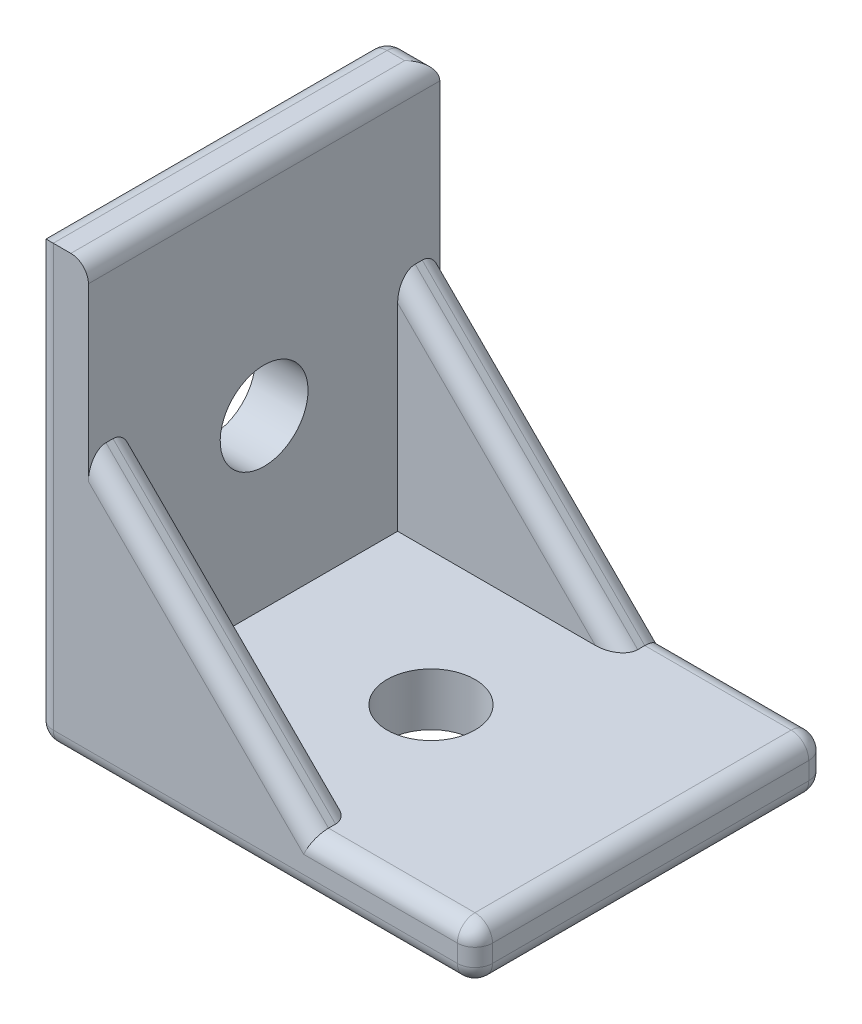
ISO-10303-21;
HEADER;
FILE_DESCRIPTION(('STEP AP214'),'2;1');
FILE_NAME('part.step','',(''),(''),'','','');
FILE_SCHEMA(('AUTOMOTIVE_DESIGN { 1 0 10303 214 1 1 1 1 }'));
ENDSEC;
DATA;
#1=APPLICATION_CONTEXT('core data for automotive mechanical design processes');
#2=APPLICATION_PROTOCOL_DEFINITION('international standard','automotive_design',2000,#1);
#3=PRODUCT_CONTEXT('',#1,'mechanical');
#4=PRODUCT('Part','Part','',(#3));
#5=PRODUCT_RELATED_PRODUCT_CATEGORY('part','',(#4));
#6=PRODUCT_DEFINITION_FORMATION('','',#4);
#7=PRODUCT_DEFINITION_CONTEXT('part definition',#1,'design');
#8=PRODUCT_DEFINITION('design','',#6,#7);
#9=PRODUCT_DEFINITION_SHAPE('','',#8);
#10=(LENGTH_UNIT() NAMED_UNIT(*) SI_UNIT(.MILLI.,.METRE.));
#11=(NAMED_UNIT(*) PLANE_ANGLE_UNIT() SI_UNIT($,.RADIAN.));
#12=(NAMED_UNIT(*) SI_UNIT($,.STERADIAN.) SOLID_ANGLE_UNIT());
#13=UNCERTAINTY_MEASURE_WITH_UNIT(LENGTH_MEASURE(1.E-05),#10,'distance_accuracy_value','');
#14=(GEOMETRIC_REPRESENTATION_CONTEXT(3) GLOBAL_UNCERTAINTY_ASSIGNED_CONTEXT((#13)) GLOBAL_UNIT_ASSIGNED_CONTEXT((#10,
#11,#12)) REPRESENTATION_CONTEXT('',''));
#15=CARTESIAN_POINT('',(0.,0.,0.));
#16=DIRECTION('',(0.,0.,1.));
#17=DIRECTION('',(1.,0.,0.));
#18=AXIS2_PLACEMENT_3D('',#15,#16,#17);
#19=CARTESIAN_POINT('',(12.5,12.5,20.));
#20=DIRECTION('',(-1.,0.,0.));
#21=DIRECTION('',(0.,-1.,0.));
#22=AXIS2_PLACEMENT_3D('',#19,#20,#21);
#23=PLANE('',#22);
#24=DIRECTION('',(0.,1.,0.));
#25=VECTOR('',#24,1.);
#26=CARTESIAN_POINT('',(12.5,-12.5,19.));
#27=LINE('',#26,#25);
#28=CARTESIAN_POINT('',(12.5,-10.5,19.));
#29=VERTEX_POINT('',#28);
#30=CARTESIAN_POINT('',(12.5,-11.5,19.));
#31=VERTEX_POINT('',#30);
#32=EDGE_CURVE('E243',#29,#31,#27,.F.);
#33=ORIENTED_EDGE('',*,*,#32,.T.);
#34=DIRECTION('',(0.,0.,-1.));
#35=VECTOR('',#34,1.);
#36=CARTESIAN_POINT('',(12.5,-11.5,20.));
#37=LINE('',#36,#35);
#38=CARTESIAN_POINT('',(12.5,-11.5,1.));
#39=VERTEX_POINT('',#38);
#40=EDGE_CURVE('E248',#31,#39,#37,.T.);
#41=ORIENTED_EDGE('',*,*,#40,.T.);
#42=DIRECTION('',(0.,1.,0.));
#43=VECTOR('',#42,1.);
#44=CARTESIAN_POINT('',(12.5,12.5,1.));
#45=LINE('',#44,#43);
#46=CARTESIAN_POINT('',(12.5,-10.5,1.));
#47=VERTEX_POINT('',#46);
#48=EDGE_CURVE('E245',#39,#47,#45,.T.);
#49=ORIENTED_EDGE('',*,*,#48,.T.);
#50=DIRECTION('',(0.,0.,1.));
#51=VECTOR('',#50,1.);
#52=CARTESIAN_POINT('',(12.5,-10.5,20.));
#53=LINE('',#52,#51);
#54=EDGE_CURVE('E241',#47,#29,#53,.T.);
#55=ORIENTED_EDGE('',*,*,#54,.T.);
#56=EDGE_LOOP('',(#33,#41,#49,#55));
#57=FACE_BOUND('',#56,.T.);
#58=ADVANCED_FACE('F37',(#57),#23,.F.);
#59=CARTESIAN_POINT('',(0.,0.,20.));
#60=DIRECTION('',(0.,0.,1.));
#61=DIRECTION('',(1.,0.,0.));
#62=AXIS2_PLACEMENT_3D('',#59,#60,#61);
#63=PLANE('',#62);
#64=DIRECTION('',(0.,-1.,0.));
#65=VECTOR('',#64,1.);
#66=CARTESIAN_POINT('',(-9.5,12.5,20.));
#67=LINE('',#66,#65);
#68=CARTESIAN_POINT('',(-9.5,11.5,20.));
#69=VERTEX_POINT('',#68);
#70=CARTESIAN_POINT('',(-9.5,1.75245310429357,20.));
#71=VERTEX_POINT('',#70);
#72=EDGE_CURVE('E380',#69,#71,#67,.T.);
#73=ORIENTED_EDGE('',*,*,#72,.F.);
#74=CARTESIAN_POINT('',(-10.5,11.5,20.));
#75=DIRECTION('',(0.,0.,1.));
#76=DIRECTION('',(1.,0.,0.));
#77=AXIS2_PLACEMENT_3D('',#74,#75,#76);
#78=CIRCLE('',#77,1.);
#79=CARTESIAN_POINT('',(-10.5,12.5,20.));
#80=VERTEX_POINT('',#79);
#81=EDGE_CURVE('E291',#69,#80,#78,.T.);
#82=ORIENTED_EDGE('',*,*,#81,.T.);
#83=DIRECTION('',(-1.,0.,0.));
#84=VECTOR('',#83,1.);
#85=CARTESIAN_POINT('',(-12.5,12.5,20.));
#86=LINE('',#85,#84);
#87=CARTESIAN_POINT('',(-11.5,12.5,20.));
#88=VERTEX_POINT('',#87);
#89=EDGE_CURVE('E210',#80,#88,#86,.T.);
#90=ORIENTED_EDGE('',*,*,#89,.T.);
#91=DIRECTION('',(0.,-1.,0.));
#92=VECTOR('',#91,1.);
#93=CARTESIAN_POINT('',(-11.5,-12.5,20.));
#94=LINE('',#93,#92);
#95=CARTESIAN_POINT('',(-11.5,-11.5,20.));
#96=VERTEX_POINT('',#95);
#97=EDGE_CURVE('E54',#88,#96,#94,.T.);
#98=ORIENTED_EDGE('',*,*,#97,.T.);
#99=DIRECTION('',(1.,0.,0.));
#100=VECTOR('',#99,1.);
#101=CARTESIAN_POINT('',(12.5,-11.5,20.));
#102=LINE('',#101,#100);
#103=CARTESIAN_POINT('',(11.5,-11.5,20.));
#104=VERTEX_POINT('',#103);
#105=EDGE_CURVE('E59',#96,#104,#102,.T.);
#106=ORIENTED_EDGE('',*,*,#105,.T.);
#107=DIRECTION('',(0.,1.,0.));
#108=VECTOR('',#107,1.);
#109=CARTESIAN_POINT('',(11.5,-9.5,20.));
#110=LINE('',#109,#108);
#111=CARTESIAN_POINT('',(11.5,-10.5,20.));
#112=VERTEX_POINT('',#111);
#113=EDGE_CURVE('E287',#104,#112,#110,.T.);
#114=ORIENTED_EDGE('',*,*,#113,.T.);
#115=DIRECTION('',(-1.,0.,0.));
#116=VECTOR('',#115,1.);
#117=CARTESIAN_POINT('',(3.16666666666667,-10.5,20.));
#118=LINE('',#117,#116);
#119=CARTESIAN_POINT('',(2.75245310429357,-10.5,20.));
#120=VERTEX_POINT('',#119);
#121=EDGE_CURVE('E285',#112,#120,#118,.T.);
#122=ORIENTED_EDGE('',*,*,#121,.T.);
#123=DIRECTION('',(0.707106781186548,-0.707106781186548,0.));
#124=VECTOR('',#123,1.);
#125=CARTESIAN_POINT('',(-10.2071067811865,2.45955988548011,20.));
#126=LINE('',#125,#124);
#127=EDGE_CURVE('E282',#120,#71,#126,.F.);
#128=ORIENTED_EDGE('',*,*,#127,.T.);
#129=EDGE_LOOP('',(#73,#82,#90,#98,#106,#114,#122,#128));
#130=FACE_BOUND('',#129,.T.);
#131=ADVANCED_FACE('F426',(#130),#63,.T.);
#132=CARTESIAN_POINT('',(0.,0.,0.));
#133=DIRECTION('',(0.,0.,1.));
#134=DIRECTION('',(1.,0.,0.));
#135=AXIS2_PLACEMENT_3D('',#132,#133,#134);
#136=PLANE('',#135);
#137=DIRECTION('',(0.,-1.,0.));
#138=VECTOR('',#137,1.);
#139=CARTESIAN_POINT('',(-9.5,12.5,0.));
#140=LINE('',#139,#138);
#141=CARTESIAN_POINT('',(-9.5,11.5,0.));
#142=VERTEX_POINT('',#141);
#143=CARTESIAN_POINT('',(-9.5,1.75245310429357,0.));
#144=VERTEX_POINT('',#143);
#145=EDGE_CURVE('E393',#142,#144,#140,.T.);
#146=ORIENTED_EDGE('',*,*,#145,.T.);
#147=DIRECTION('',(0.707106781186548,-0.707106781186548,0.));
#148=VECTOR('',#147,1.);
#149=CARTESIAN_POINT('',(-3.87377344785321,-3.87377344785321,0.));
#150=LINE('',#149,#148);
#151=CARTESIAN_POINT('',(2.75245310429357,-10.5,0.));
#152=VERTEX_POINT('',#151);
#153=EDGE_CURVE('E233',#144,#152,#150,.T.);
#154=ORIENTED_EDGE('',*,*,#153,.T.);
#155=DIRECTION('',(-1.,0.,0.));
#156=VECTOR('',#155,1.);
#157=CARTESIAN_POINT('',(0.,-10.5,0.));
#158=LINE('',#157,#156);
#159=CARTESIAN_POINT('',(11.5,-10.5,0.));
#160=VERTEX_POINT('',#159);
#161=EDGE_CURVE('E231',#152,#160,#158,.F.);
#162=ORIENTED_EDGE('',*,*,#161,.T.);
#163=DIRECTION('',(0.,1.,0.));
#164=VECTOR('',#163,1.);
#165=CARTESIAN_POINT('',(11.5,0.,0.));
#166=LINE('',#165,#164);
#167=CARTESIAN_POINT('',(11.5,-11.5,0.));
#168=VERTEX_POINT('',#167);
#169=EDGE_CURVE('E229',#160,#168,#166,.F.);
#170=ORIENTED_EDGE('',*,*,#169,.T.);
#171=DIRECTION('',(1.,0.,0.));
#172=VECTOR('',#171,1.);
#173=CARTESIAN_POINT('',(0.,-11.5,0.));
#174=LINE('',#173,#172);
#175=CARTESIAN_POINT('',(-11.5,-11.5,0.));
#176=VERTEX_POINT('',#175);
#177=EDGE_CURVE('E227',#168,#176,#174,.F.);
#178=ORIENTED_EDGE('',*,*,#177,.T.);
#179=DIRECTION('',(0.,-1.,0.));
#180=VECTOR('',#179,1.);
#181=CARTESIAN_POINT('',(-11.5,0.,0.));
#182=LINE('',#181,#180);
#183=CARTESIAN_POINT('',(-11.5,11.5,0.));
#184=VERTEX_POINT('',#183);
#185=EDGE_CURVE('E225',#176,#184,#182,.F.);
#186=ORIENTED_EDGE('',*,*,#185,.T.);
#187=DIRECTION('',(-1.,0.,0.));
#188=VECTOR('',#187,1.);
#189=CARTESIAN_POINT('',(0.,11.5,0.));
#190=LINE('',#189,#188);
#191=EDGE_CURVE('E223',#184,#142,#190,.F.);
#192=ORIENTED_EDGE('',*,*,#191,.T.);
#193=EDGE_LOOP('',(#146,#154,#162,#170,#178,#186,#192));
#194=FACE_BOUND('',#193,.T.);
#195=ADVANCED_FACE('F432',(#194),#136,.F.);
#196=CARTESIAN_POINT('',(-12.5,12.5,20.));
#197=DIRECTION('',(0.,-1.,0.));
#198=DIRECTION('',(0.,0.,-1.));
#199=AXIS2_PLACEMENT_3D('',#196,#197,#198);
#200=PLANE('',#199);
#201=ORIENTED_EDGE('',*,*,#89,.F.);
#202=DIRECTION('',(0.,0.,1.));
#203=VECTOR('',#202,1.);
#204=CARTESIAN_POINT('',(-10.5,12.5,20.));
#205=LINE('',#204,#203);
#206=CARTESIAN_POINT('',(-10.5,12.5,1.));
#207=VERTEX_POINT('',#206);
#208=EDGE_CURVE('E278',#80,#207,#205,.F.);
#209=ORIENTED_EDGE('',*,*,#208,.T.);
#210=DIRECTION('',(-1.,0.,0.));
#211=VECTOR('',#210,1.);
#212=CARTESIAN_POINT('',(-12.5,12.5,1.));
#213=LINE('',#212,#211);
#214=CARTESIAN_POINT('',(-11.5,12.5,1.));
#215=VERTEX_POINT('',#214);
#216=EDGE_CURVE('E276',#207,#215,#213,.T.);
#217=ORIENTED_EDGE('',*,*,#216,.T.);
#218=DIRECTION('',(0.,0.,-1.));
#219=VECTOR('',#218,1.);
#220=CARTESIAN_POINT('',(-11.5,12.5,20.));
#221=LINE('',#220,#219);
#222=EDGE_CURVE('E274',#215,#88,#221,.F.);
#223=ORIENTED_EDGE('',*,*,#222,.T.);
#224=EDGE_LOOP('',(#201,#209,#217,#223));
#225=FACE_BOUND('',#224,.T.);
#226=ADVANCED_FACE('F435',(#225),#200,.F.);
#227=CARTESIAN_POINT('',(-12.5,12.5,20.));
#228=DIRECTION('',(1.,0.,0.));
#229=DIRECTION('',(0.,1.,0.));
#230=AXIS2_PLACEMENT_3D('',#227,#228,#229);
#231=PLANE('',#230);
#232=CARTESIAN_POINT('',(-12.5,0.,10.));
#233=DIRECTION('',(-1.,0.,0.));
#234=DIRECTION('',(0.,-1.,0.));
#235=AXIS2_PLACEMENT_3D('',#232,#233,#234);
#236=CIRCLE('',#235,2.5);
#237=CARTESIAN_POINT('',(-12.5,-2.5,10.));
#238=VERTEX_POINT('',#237);
#239=EDGE_CURVE('E390',#238,#238,#236,.T.);
#240=ORIENTED_EDGE('',*,*,#239,.F.);
#241=EDGE_LOOP('',(#240));
#242=FACE_BOUND('',#241,.T.);
#243=DIRECTION('',(0.,-1.,0.));
#244=VECTOR('',#243,1.);
#245=CARTESIAN_POINT('',(-12.5,12.5,1.));
#246=LINE('',#245,#244);
#247=CARTESIAN_POINT('',(-12.5,11.5,1.));
#248=VERTEX_POINT('',#247);
#249=CARTESIAN_POINT('',(-12.5,-11.5,1.));
#250=VERTEX_POINT('',#249);
#251=EDGE_CURVE('E269',#248,#250,#246,.T.);
#252=ORIENTED_EDGE('',*,*,#251,.T.);
#253=DIRECTION('',(0.,0.,-1.));
#254=VECTOR('',#253,1.);
#255=CARTESIAN_POINT('',(-12.5,-11.5,20.));
#256=LINE('',#255,#254);
#257=CARTESIAN_POINT('',(-12.5,-11.5,19.));
#258=VERTEX_POINT('',#257);
#259=EDGE_CURVE('E271',#250,#258,#256,.F.);
#260=ORIENTED_EDGE('',*,*,#259,.T.);
#261=DIRECTION('',(0.,-1.,0.));
#262=VECTOR('',#261,1.);
#263=CARTESIAN_POINT('',(-12.5,12.5,19.));
#264=LINE('',#263,#262);
#265=CARTESIAN_POINT('',(-12.5,11.5,19.));
#266=VERTEX_POINT('',#265);
#267=EDGE_CURVE('E265',#258,#266,#264,.F.);
#268=ORIENTED_EDGE('',*,*,#267,.T.);
#269=DIRECTION('',(0.,0.,-1.));
#270=VECTOR('',#269,1.);
#271=CARTESIAN_POINT('',(-12.5,11.5,20.));
#272=LINE('',#271,#270);
#273=EDGE_CURVE('E267',#266,#248,#272,.T.);
#274=ORIENTED_EDGE('',*,*,#273,.T.);
#275=EDGE_LOOP('',(#252,#260,#268,#274));
#276=FACE_BOUND('',#275,.T.);
#277=ADVANCED_FACE('F548',(#242,#276),#231,.F.);
#278=CARTESIAN_POINT('',(-12.5,-12.5,20.));
#279=DIRECTION('',(0.,1.,0.));
#280=DIRECTION('',(0.,0.,1.));
#281=AXIS2_PLACEMENT_3D('',#278,#279,#280);
#282=PLANE('',#281);
#283=CARTESIAN_POINT('',(0.,-12.5,10.));
#284=DIRECTION('',(0.,-1.,0.));
#285=DIRECTION('',(0.,0.,-1.));
#286=AXIS2_PLACEMENT_3D('',#283,#284,#285);
#287=CIRCLE('',#286,2.5);
#288=CARTESIAN_POINT('',(0.,-12.5,7.5));
#289=VERTEX_POINT('',#288);
#290=EDGE_CURVE('E382',#289,#289,#287,.T.);
#291=ORIENTED_EDGE('',*,*,#290,.F.);
#292=EDGE_LOOP('',(#291));
#293=FACE_BOUND('',#292,.T.);
#294=DIRECTION('',(0.,0.,-1.));
#295=VECTOR('',#294,1.);
#296=CARTESIAN_POINT('',(-11.5,-12.5,20.));
#297=LINE('',#296,#295);
#298=CARTESIAN_POINT('',(-11.5,-12.5,19.));
#299=VERTEX_POINT('',#298);
#300=CARTESIAN_POINT('',(-11.5,-12.5,1.));
#301=VERTEX_POINT('',#300);
#302=EDGE_CURVE('E260',#299,#301,#297,.T.);
#303=ORIENTED_EDGE('',*,*,#302,.T.);
#304=DIRECTION('',(1.,0.,0.));
#305=VECTOR('',#304,1.);
#306=CARTESIAN_POINT('',(-12.5,-12.5,1.));
#307=LINE('',#306,#305);
#308=CARTESIAN_POINT('',(11.5,-12.5,1.));
#309=VERTEX_POINT('',#308);
#310=EDGE_CURVE('E262',#301,#309,#307,.T.);
#311=ORIENTED_EDGE('',*,*,#310,.T.);
#312=DIRECTION('',(0.,0.,-1.));
#313=VECTOR('',#312,1.);
#314=CARTESIAN_POINT('',(11.5,-12.5,20.));
#315=LINE('',#314,#313);
#316=CARTESIAN_POINT('',(11.5,-12.5,19.));
#317=VERTEX_POINT('',#316);
#318=EDGE_CURVE('E256',#309,#317,#315,.F.);
#319=ORIENTED_EDGE('',*,*,#318,.T.);
#320=DIRECTION('',(1.,0.,0.));
#321=VECTOR('',#320,1.);
#322=CARTESIAN_POINT('',(-12.5,-12.5,19.));
#323=LINE('',#322,#321);
#324=EDGE_CURVE('E258',#317,#299,#323,.F.);
#325=ORIENTED_EDGE('',*,*,#324,.T.);
#326=EDGE_LOOP('',(#303,#311,#319,#325));
#327=FACE_BOUND('',#326,.T.);
#328=ADVANCED_FACE('F586',(#293,#327),#282,.F.);
#329=CARTESIAN_POINT('',(12.5,-9.5,2.4));
#330=DIRECTION('',(0.,-1.,0.));
#331=DIRECTION('',(1.,0.,0.));
#332=AXIS2_PLACEMENT_3D('',#329,#330,#331);
#333=PLANE('',#332);
#334=CARTESIAN_POINT('',(0.,-9.5,10.));
#335=DIRECTION('',(0.,-1.,0.));
#336=DIRECTION('',(1.,0.,0.));
#337=AXIS2_PLACEMENT_3D('',#334,#335,#336);
#338=CIRCLE('',#337,2.5);
#339=CARTESIAN_POINT('',(2.50000000000001,-9.5,10.));
#340=VERTEX_POINT('',#339);
#341=EDGE_CURVE('E312',#340,#340,#338,.T.);
#342=ORIENTED_EDGE('',*,*,#341,.T.);
#343=EDGE_LOOP('',(#342));
#344=FACE_BOUND('',#343,.T.);
#345=DIRECTION('',(0.,0.,1.));
#346=VECTOR('',#345,1.);
#347=CARTESIAN_POINT('',(11.5,-9.5,2.4));
#348=LINE('',#347,#346);
#349=CARTESIAN_POINT('',(11.5,-9.5,19.));
#350=VERTEX_POINT('',#349);
#351=CARTESIAN_POINT('',(11.5,-9.5,1.));
#352=VERTEX_POINT('',#351);
#353=EDGE_CURVE('E252',#350,#352,#348,.F.);
#354=ORIENTED_EDGE('',*,*,#353,.T.);
#355=DIRECTION('',(-1.,0.,0.));
#356=VECTOR('',#355,1.);
#357=CARTESIAN_POINT('',(12.5,-9.5,1.));
#358=LINE('',#357,#356);
#359=CARTESIAN_POINT('',(3.16666666666667,-9.5,1.));
#360=VERTEX_POINT('',#359);
#361=EDGE_CURVE('E254',#352,#360,#358,.T.);
#362=ORIENTED_EDGE('',*,*,#361,.T.);
#363=DIRECTION('',(0.,0.,1.));
#364=VECTOR('',#363,1.);
#365=CARTESIAN_POINT('',(3.16666666666667,-9.5,0.));
#366=LINE('',#365,#364);
#367=CARTESIAN_POINT('',(3.16666666666667,-9.5,1.4));
#368=VERTEX_POINT('',#367);
#369=EDGE_CURVE('E220',#360,#368,#366,.T.);
#370=ORIENTED_EDGE('',*,*,#369,.T.);
#371=CARTESIAN_POINT('',(1.75245310429357,-9.5,1.4));
#372=DIRECTION('',(0.,-1.,0.));
#373=DIRECTION('',(-1.,0.,0.));
#374=AXIS2_PLACEMENT_3D('',#371,#372,#373);
#375=ELLIPSE('',#374,1.41421356237309,1.);
#376=CARTESIAN_POINT('',(1.75245310429357,-9.5,2.4));
#377=VERTEX_POINT('',#376);
#378=EDGE_CURVE('E215',#368,#377,#375,.T.);
#379=ORIENTED_EDGE('',*,*,#378,.T.);
#380=DIRECTION('',(1.,0.,0.));
#381=VECTOR('',#380,1.);
#382=CARTESIAN_POINT('',(12.5,-9.5,2.4));
#383=LINE('',#382,#381);
#384=CARTESIAN_POINT('',(-9.5,-9.5,2.4));
#385=VERTEX_POINT('',#384);
#386=EDGE_CURVE('E195',#385,#377,#383,.T.);
#387=ORIENTED_EDGE('',*,*,#386,.F.);
#388=DIRECTION('',(0.,0.,1.));
#389=VECTOR('',#388,1.);
#390=CARTESIAN_POINT('',(-9.5,-9.5,2.4));
#391=LINE('',#390,#389);
#392=CARTESIAN_POINT('',(-9.5,-9.5,17.6));
#393=VERTEX_POINT('',#392);
#394=EDGE_CURVE('E202',#385,#393,#391,.T.);
#395=ORIENTED_EDGE('',*,*,#394,.T.);
#396=DIRECTION('',(1.,0.,0.));
#397=VECTOR('',#396,1.);
#398=CARTESIAN_POINT('',(12.5,-9.5,17.6));
#399=LINE('',#398,#397);
#400=CARTESIAN_POINT('',(1.75245310429357,-9.5,17.6));
#401=VERTEX_POINT('',#400);
#402=EDGE_CURVE('E199',#393,#401,#399,.T.);
#403=ORIENTED_EDGE('',*,*,#402,.T.);
#404=CARTESIAN_POINT('',(1.75245310429357,-9.5,18.6));
#405=DIRECTION('',(0.,-1.,0.));
#406=DIRECTION('',(1.,0.,0.));
#407=AXIS2_PLACEMENT_3D('',#404,#405,#406);
#408=ELLIPSE('',#407,1.41421356237309,1.);
#409=CARTESIAN_POINT('',(3.16666666666667,-9.5,18.6));
#410=VERTEX_POINT('',#409);
#411=EDGE_CURVE('E46',#401,#410,#408,.T.);
#412=ORIENTED_EDGE('',*,*,#411,.T.);
#413=CARTESIAN_POINT('',(3.16666666666667,-9.5,19.));
#414=VERTEX_POINT('',#413);
#415=EDGE_CURVE('E399',#410,#414,#366,.T.);
#416=ORIENTED_EDGE('',*,*,#415,.T.);
#417=DIRECTION('',(-1.,0.,0.));
#418=VECTOR('',#417,1.);
#419=CARTESIAN_POINT('',(12.5,-9.5,19.));
#420=LINE('',#419,#418);
#421=EDGE_CURVE('E250',#414,#350,#420,.F.);
#422=ORIENTED_EDGE('',*,*,#421,.T.);
#423=EDGE_LOOP('',(#354,#362,#370,#379,#387,#395,#403,#412,#416,#422));
#424=FACE_BOUND('',#423,.T.);
#425=ADVANCED_FACE('F212',(#344,#424),#333,.F.);
#426=CARTESIAN_POINT('',(-9.5,12.5,2.4));
#427=DIRECTION('',(-1.,0.,0.));
#428=DIRECTION('',(0.,-1.,0.));
#429=AXIS2_PLACEMENT_3D('',#426,#427,#428);
#430=PLANE('',#429);
#431=CARTESIAN_POINT('',(-9.49999999999999,0.,10.));
#432=DIRECTION('',(-1.,0.,0.));
#433=DIRECTION('',(0.,-1.,0.));
#434=AXIS2_PLACEMENT_3D('',#431,#432,#433);
#435=CIRCLE('',#434,2.5);
#436=CARTESIAN_POINT('',(-9.49999999999999,-2.5,10.));
#437=VERTEX_POINT('',#436);
#438=EDGE_CURVE('E41',#437,#437,#435,.T.);
#439=ORIENTED_EDGE('',*,*,#438,.T.);
#440=EDGE_LOOP('',(#439));
#441=FACE_BOUND('',#440,.T.);
#442=ORIENTED_EDGE('',*,*,#145,.F.);
#443=DIRECTION('',(0.,0.,1.));
#444=VECTOR('',#443,1.);
#445=CARTESIAN_POINT('',(-9.5,11.5,2.4));
#446=LINE('',#445,#444);
#447=EDGE_CURVE('E280',#142,#69,#446,.T.);
#448=ORIENTED_EDGE('',*,*,#447,.T.);
#449=ORIENTED_EDGE('',*,*,#72,.T.);
#450=CARTESIAN_POINT('',(-9.5,1.75245310429357,19.));
#451=DIRECTION('',(-1.,0.,0.));
#452=DIRECTION('',(0.,1.,0.));
#453=AXIS2_PLACEMENT_3D('',#450,#451,#452);
#454=ELLIPSE('',#453,1.4142135623731,1.);
#455=CARTESIAN_POINT('',(-9.5,3.16666666666666,19.));
#456=VERTEX_POINT('',#455);
#457=EDGE_CURVE('E11',#71,#456,#454,.T.);
#458=ORIENTED_EDGE('',*,*,#457,.T.);
#459=DIRECTION('',(0.,0.,1.));
#460=VECTOR('',#459,1.);
#461=CARTESIAN_POINT('',(-9.5,3.16666666666666,0.));
#462=LINE('',#461,#460);
#463=CARTESIAN_POINT('',(-9.5,3.16666666666666,18.6));
#464=VERTEX_POINT('',#463);
#465=EDGE_CURVE('E395',#464,#456,#462,.T.);
#466=ORIENTED_EDGE('',*,*,#465,.F.);
#467=CARTESIAN_POINT('',(-9.5,1.75245310429357,18.6));
#468=DIRECTION('',(-1.,0.,0.));
#469=DIRECTION('',(0.,-1.,0.));
#470=AXIS2_PLACEMENT_3D('',#467,#468,#469);
#471=ELLIPSE('',#470,1.4142135623731,1.);
#472=CARTESIAN_POINT('',(-9.5,1.75245310429357,17.6));
#473=VERTEX_POINT('',#472);
#474=EDGE_CURVE('E306',#464,#473,#471,.T.);
#475=ORIENTED_EDGE('',*,*,#474,.T.);
#476=DIRECTION('',(0.,-1.,0.));
#477=VECTOR('',#476,1.);
#478=CARTESIAN_POINT('',(-9.5,12.5,17.6));
#479=LINE('',#478,#477);
#480=EDGE_CURVE('E206',#473,#393,#479,.T.);
#481=ORIENTED_EDGE('',*,*,#480,.T.);
#482=ORIENTED_EDGE('',*,*,#394,.F.);
#483=DIRECTION('',(0.,-1.,0.));
#484=VECTOR('',#483,1.);
#485=CARTESIAN_POINT('',(-9.5,12.5,2.4));
#486=LINE('',#485,#484);
#487=CARTESIAN_POINT('',(-9.5,1.75245310429357,2.4));
#488=VERTEX_POINT('',#487);
#489=EDGE_CURVE('E191',#488,#385,#486,.T.);
#490=ORIENTED_EDGE('',*,*,#489,.F.);
#491=CARTESIAN_POINT('',(-9.5,1.75245310429357,1.4));
#492=DIRECTION('',(-1.,0.,0.));
#493=DIRECTION('',(0.,1.,0.));
#494=AXIS2_PLACEMENT_3D('',#491,#492,#493);
#495=ELLIPSE('',#494,1.4142135623731,1.);
#496=CARTESIAN_POINT('',(-9.5,3.16666666666666,1.4));
#497=VERTEX_POINT('',#496);
#498=EDGE_CURVE('E303',#488,#497,#495,.T.);
#499=ORIENTED_EDGE('',*,*,#498,.T.);
#500=CARTESIAN_POINT('',(-9.5,3.16666666666666,1.));
#501=VERTEX_POINT('',#500);
#502=EDGE_CURVE('E398',#501,#497,#462,.T.);
#503=ORIENTED_EDGE('',*,*,#502,.F.);
#504=CARTESIAN_POINT('',(-9.5,1.75245310429357,1.));
#505=DIRECTION('',(-1.,0.,0.));
#506=DIRECTION('',(0.,-1.,0.));
#507=AXIS2_PLACEMENT_3D('',#504,#505,#506);
#508=ELLIPSE('',#507,1.4142135623731,1.);
#509=EDGE_CURVE('E300',#501,#144,#508,.T.);
#510=ORIENTED_EDGE('',*,*,#509,.T.);
#511=EDGE_LOOP('',(#442,#448,#449,#458,#466,#475,#481,#482,#490,#499,#503,#510));
#512=FACE_BOUND('',#511,.T.);
#513=ADVANCED_FACE('F204',(#441,#512),#430,.F.);
#514=CARTESIAN_POINT('',(0.,0.,2.4));
#515=DIRECTION('',(0.,0.,-1.));
#516=DIRECTION('',(-1.,0.,0.));
#517=AXIS2_PLACEMENT_3D('',#514,#515,#516);
#518=PLANE('',#517);
#519=ORIENTED_EDGE('',*,*,#386,.T.);
#520=DIRECTION('',(-0.707106781186548,0.707106781186548,0.));
#521=VECTOR('',#520,1.);
#522=CARTESIAN_POINT('',(-3.87377344785321,-3.87377344785321,2.4));
#523=LINE('',#522,#521);
#524=EDGE_CURVE('E197',#377,#488,#523,.T.);
#525=ORIENTED_EDGE('',*,*,#524,.T.);
#526=ORIENTED_EDGE('',*,*,#489,.T.);
#527=EDGE_LOOP('',(#519,#525,#526));
#528=FACE_BOUND('',#527,.T.);
#529=ADVANCED_FACE('F193',(#528),#518,.F.);
#530=CARTESIAN_POINT('',(0.,0.,17.6));
#531=DIRECTION('',(0.,0.,-1.));
#532=DIRECTION('',(-1.,0.,0.));
#533=AXIS2_PLACEMENT_3D('',#530,#531,#532);
#534=PLANE('',#533);
#535=ORIENTED_EDGE('',*,*,#480,.F.);
#536=DIRECTION('',(-0.707106781186548,0.707106781186548,0.));
#537=VECTOR('',#536,1.);
#538=CARTESIAN_POINT('',(2.45955988548012,-10.2071067811866,17.6));
#539=LINE('',#538,#537);
#540=EDGE_CURVE('E298',#473,#401,#539,.F.);
#541=ORIENTED_EDGE('',*,*,#540,.T.);
#542=ORIENTED_EDGE('',*,*,#402,.F.);
#543=EDGE_LOOP('',(#535,#541,#542));
#544=FACE_BOUND('',#543,.T.);
#545=ADVANCED_FACE('F575',(#544),#534,.T.);
#546=CARTESIAN_POINT('',(-9.5,3.16666666666666,0.));
#547=DIRECTION('',(-0.707106781186548,-0.707106781186548,0.));
#548=DIRECTION('',(0.707106781186548,-0.707106781186548,0.));
#549=AXIS2_PLACEMENT_3D('',#546,#547,#548);
#550=PLANE('',#549);
#551=ORIENTED_EDGE('',*,*,#415,.F.);
#552=DIRECTION('',(-0.707106781186548,0.707106781186548,0.));
#553=VECTOR('',#552,1.);
#554=CARTESIAN_POINT('',(-9.5,3.16666666666666,18.6));
#555=LINE('',#554,#553);
#556=EDGE_CURVE('E295',#410,#464,#555,.T.);
#557=ORIENTED_EDGE('',*,*,#556,.T.);
#558=ORIENTED_EDGE('',*,*,#465,.T.);
#559=DIRECTION('',(0.707106781186548,-0.707106781186548,0.));
#560=VECTOR('',#559,1.);
#561=CARTESIAN_POINT('',(3.16666666666667,-9.50000000000001,19.));
#562=LINE('',#561,#560);
#563=EDGE_CURVE('E293',#456,#414,#562,.T.);
#564=ORIENTED_EDGE('',*,*,#563,.T.);
#565=EDGE_LOOP('',(#551,#557,#558,#564));
#566=FACE_BOUND('',#565,.T.);
#567=ADVANCED_FACE('F526',(#566),#550,.F.);
#568=ORIENTED_EDGE('',*,*,#369,.F.);
#569=DIRECTION('',(0.707106781186548,-0.707106781186548,0.));
#570=VECTOR('',#569,1.);
#571=CARTESIAN_POINT('',(-9.5,3.16666666666666,1.));
#572=LINE('',#571,#570);
#573=EDGE_CURVE('E238',#360,#501,#572,.F.);
#574=ORIENTED_EDGE('',*,*,#573,.T.);
#575=ORIENTED_EDGE('',*,*,#502,.T.);
#576=DIRECTION('',(-0.707106781186548,0.707106781186548,0.));
#577=VECTOR('',#576,1.);
#578=CARTESIAN_POINT('',(-9.5,3.16666666666666,1.4));
#579=LINE('',#578,#577);
#580=EDGE_CURVE('E236',#497,#368,#579,.F.);
#581=ORIENTED_EDGE('',*,*,#580,.T.);
#582=EDGE_LOOP('',(#568,#574,#575,#581));
#583=FACE_BOUND('',#582,.T.);
#584=ADVANCED_FACE('F408',(#583),#550,.F.);
#585=CARTESIAN_POINT('',(-10.5,11.5,2.4));
#586=DIRECTION('',(0.,0.,1.));
#587=DIRECTION('',(1.,0.,0.));
#588=AXIS2_PLACEMENT_3D('',#585,#586,#587);
#589=CYLINDRICAL_SURFACE('',#588,1.);
#590=ORIENTED_EDGE('',*,*,#81,.F.);
#591=ORIENTED_EDGE('',*,*,#447,.F.);
#592=CARTESIAN_POINT('',(-10.5,11.5,1.));
#593=DIRECTION('',(0.707106781186547,0.,0.707106781186547));
#594=DIRECTION('',(-0.707106781186547,0.,0.707106781186547));
#595=AXIS2_PLACEMENT_3D('',#592,#593,#594);
#596=ELLIPSE('',#595,1.41421356237309,1.);
#597=EDGE_CURVE('E378',#207,#142,#596,.F.);
#598=ORIENTED_EDGE('',*,*,#597,.F.);
#599=ORIENTED_EDGE('',*,*,#208,.F.);
#600=EDGE_LOOP('',(#590,#591,#598,#599));
#601=FACE_BOUND('',#600,.T.);
#602=ADVANCED_FACE('F519',(#601),#589,.T.);
#603=CARTESIAN_POINT('',(-12.5,11.5,1.));
#604=DIRECTION('',(-1.,0.,0.));
#605=DIRECTION('',(0.,0.,1.));
#606=AXIS2_PLACEMENT_3D('',#603,#604,#605);
#607=CYLINDRICAL_SURFACE('',#606,1.);
#608=ORIENTED_EDGE('',*,*,#597,.T.);
#609=ORIENTED_EDGE('',*,*,#191,.F.);
#610=CARTESIAN_POINT('',(-11.5,11.5,1.));
#611=DIRECTION('',(-1.,0.,0.));
#612=DIRECTION('',(0.,0.,1.));
#613=AXIS2_PLACEMENT_3D('',#610,#611,#612);
#614=CIRCLE('',#613,1.);
#615=EDGE_CURVE('E372',#215,#184,#614,.T.);
#616=ORIENTED_EDGE('',*,*,#615,.F.);
#617=ORIENTED_EDGE('',*,*,#216,.F.);
#618=EDGE_LOOP('',(#608,#609,#616,#617));
#619=FACE_BOUND('',#618,.T.);
#620=ADVANCED_FACE('F516',(#619),#607,.T.);
#621=CARTESIAN_POINT('',(-11.5,11.5,20.));
#622=DIRECTION('',(0.,0.,-1.));
#623=DIRECTION('',(-1.,0.,0.));
#624=AXIS2_PLACEMENT_3D('',#621,#622,#623);
#625=CYLINDRICAL_SURFACE('',#624,1.);
#626=CARTESIAN_POINT('',(-11.5,11.5,1.));
#627=DIRECTION('',(0.,0.,-1.));
#628=DIRECTION('',(-1.,0.,0.));
#629=AXIS2_PLACEMENT_3D('',#626,#627,#628);
#630=CIRCLE('',#629,1.);
#631=EDGE_CURVE('E369',#248,#215,#630,.T.);
#632=ORIENTED_EDGE('',*,*,#631,.F.);
#633=ORIENTED_EDGE('',*,*,#273,.F.);
#634=CARTESIAN_POINT('',(-11.5,11.5,19.));
#635=DIRECTION('',(0.,0.707106781186547,-0.707106781186547));
#636=DIRECTION('',(0.,0.707106781186547,0.707106781186547));
#637=AXIS2_PLACEMENT_3D('',#634,#635,#636);
#638=ELLIPSE('',#637,1.41421356237309,1.);
#639=EDGE_CURVE('E375',#88,#266,#638,.F.);
#640=ORIENTED_EDGE('',*,*,#639,.F.);
#641=ORIENTED_EDGE('',*,*,#222,.F.);
#642=EDGE_LOOP('',(#632,#633,#640,#641));
#643=FACE_BOUND('',#642,.T.);
#644=ADVANCED_FACE('F512',(#643),#625,.T.);
#645=CARTESIAN_POINT('',(-11.5,0.,19.));
#646=DIRECTION('',(0.,1.,0.));
#647=DIRECTION('',(-1.,0.,0.));
#648=AXIS2_PLACEMENT_3D('',#645,#646,#647);
#649=CYLINDRICAL_SURFACE('',#648,1.);
#650=ORIENTED_EDGE('',*,*,#639,.T.);
#651=ORIENTED_EDGE('',*,*,#267,.F.);
#652=CARTESIAN_POINT('',(-11.5,-11.5,19.));
#653=DIRECTION('',(0.,-1.,0.));
#654=DIRECTION('',(0.,0.,-1.));
#655=AXIS2_PLACEMENT_3D('',#652,#653,#654);
#656=CIRCLE('',#655,1.);
#657=EDGE_CURVE('E366',#96,#258,#656,.T.);
#658=ORIENTED_EDGE('',*,*,#657,.F.);
#659=ORIENTED_EDGE('',*,*,#97,.F.);
#660=EDGE_LOOP('',(#650,#651,#658,#659));
#661=FACE_BOUND('',#660,.T.);
#662=ADVANCED_FACE('F508',(#661),#649,.T.);
#663=CARTESIAN_POINT('',(-11.5,11.5,1.));
#664=DIRECTION('',(0.,0.,1.));
#665=DIRECTION('',(1.,0.,0.));
#666=AXIS2_PLACEMENT_3D('',#663,#664,#665);
#667=SPHERICAL_SURFACE('',#666,1.);
#668=ORIENTED_EDGE('',*,*,#631,.T.);
#669=ORIENTED_EDGE('',*,*,#615,.T.);
#670=CARTESIAN_POINT('',(-11.5,11.5,1.));
#671=DIRECTION('',(0.,1.,0.));
#672=DIRECTION('',(0.,0.,1.));
#673=AXIS2_PLACEMENT_3D('',#670,#671,#672);
#674=CIRCLE('',#673,1.);
#675=EDGE_CURVE('E363',#248,#184,#674,.F.);
#676=ORIENTED_EDGE('',*,*,#675,.F.);
#677=EDGE_LOOP('',(#668,#669,#676));
#678=FACE_BOUND('',#677,.T.);
#679=ADVANCED_FACE('F504',(#678),#667,.T.);
#680=CARTESIAN_POINT('',(-11.5,-11.5,19.));
#681=DIRECTION('',(0.,0.,1.));
#682=DIRECTION('',(1.,0.,0.));
#683=AXIS2_PLACEMENT_3D('',#680,#681,#682);
#684=SPHERICAL_SURFACE('',#683,1.);
#685=CARTESIAN_POINT('',(-11.5,-11.5,19.));
#686=DIRECTION('',(-1.,0.,0.));
#687=DIRECTION('',(0.,0.,1.));
#688=AXIS2_PLACEMENT_3D('',#685,#686,#687);
#689=CIRCLE('',#688,1.);
#690=EDGE_CURVE('E358',#96,#299,#689,.F.);
#691=ORIENTED_EDGE('',*,*,#690,.F.);
#692=ORIENTED_EDGE('',*,*,#657,.T.);
#693=CARTESIAN_POINT('',(-11.5,-11.5,19.));
#694=DIRECTION('',(0.,0.,1.));
#695=DIRECTION('',(1.,0.,0.));
#696=AXIS2_PLACEMENT_3D('',#693,#694,#695);
#697=CIRCLE('',#696,1.);
#698=EDGE_CURVE('E361',#299,#258,#697,.F.);
#699=ORIENTED_EDGE('',*,*,#698,.F.);
#700=EDGE_LOOP('',(#691,#692,#699));
#701=FACE_BOUND('',#700,.T.);
#702=ADVANCED_FACE('F500',(#701),#684,.T.);
#703=CARTESIAN_POINT('',(-11.5,12.5,1.));
#704=DIRECTION('',(0.,-1.,0.));
#705=DIRECTION('',(1.,0.,0.));
#706=AXIS2_PLACEMENT_3D('',#703,#704,#705);
#707=CYLINDRICAL_SURFACE('',#706,1.);
#708=ORIENTED_EDGE('',*,*,#675,.T.);
#709=ORIENTED_EDGE('',*,*,#185,.F.);
#710=CARTESIAN_POINT('',(-11.5,-11.5,1.));
#711=DIRECTION('',(0.,-1.,0.));
#712=DIRECTION('',(0.,0.,-1.));
#713=AXIS2_PLACEMENT_3D('',#710,#711,#712);
#714=CIRCLE('',#713,1.);
#715=EDGE_CURVE('E355',#250,#176,#714,.T.);
#716=ORIENTED_EDGE('',*,*,#715,.F.);
#717=ORIENTED_EDGE('',*,*,#251,.F.);
#718=EDGE_LOOP('',(#708,#709,#716,#717));
#719=FACE_BOUND('',#718,.T.);
#720=ADVANCED_FACE('F496',(#719),#707,.T.);
#721=CARTESIAN_POINT('',(-11.5,-11.5,20.));
#722=DIRECTION('',(0.,0.,-1.));
#723=DIRECTION('',(-1.,0.,0.));
#724=AXIS2_PLACEMENT_3D('',#721,#722,#723);
#725=CYLINDRICAL_SURFACE('',#724,1.);
#726=ORIENTED_EDGE('',*,*,#698,.T.);
#727=ORIENTED_EDGE('',*,*,#259,.F.);
#728=CARTESIAN_POINT('',(-11.5,-11.5,1.));
#729=DIRECTION('',(0.,0.,-1.));
#730=DIRECTION('',(-1.,0.,0.));
#731=AXIS2_PLACEMENT_3D('',#728,#729,#730);
#732=CIRCLE('',#731,1.);
#733=EDGE_CURVE('E352',#301,#250,#732,.T.);
#734=ORIENTED_EDGE('',*,*,#733,.F.);
#735=ORIENTED_EDGE('',*,*,#302,.F.);
#736=EDGE_LOOP('',(#726,#727,#734,#735));
#737=FACE_BOUND('',#736,.T.);
#738=ADVANCED_FACE('F492',(#737),#725,.T.);
#739=CARTESIAN_POINT('',(0.,-11.5,19.));
#740=DIRECTION('',(-1.,0.,0.));
#741=DIRECTION('',(0.,0.,1.));
#742=AXIS2_PLACEMENT_3D('',#739,#740,#741);
#743=CYLINDRICAL_SURFACE('',#742,1.);
#744=ORIENTED_EDGE('',*,*,#690,.T.);
#745=ORIENTED_EDGE('',*,*,#324,.F.);
#746=CARTESIAN_POINT('',(11.5,-11.5,19.));
#747=DIRECTION('',(1.,0.,0.));
#748=DIRECTION('',(0.,0.,-1.));
#749=AXIS2_PLACEMENT_3D('',#746,#747,#748);
#750=CIRCLE('',#749,1.);
#751=EDGE_CURVE('E349',#104,#317,#750,.T.);
#752=ORIENTED_EDGE('',*,*,#751,.F.);
#753=ORIENTED_EDGE('',*,*,#105,.F.);
#754=EDGE_LOOP('',(#744,#745,#752,#753));
#755=FACE_BOUND('',#754,.T.);
#756=ADVANCED_FACE('F488',(#755),#743,.T.);
#757=CARTESIAN_POINT('',(-11.5,-11.5,1.));
#758=DIRECTION('',(0.,0.,1.));
#759=DIRECTION('',(1.,0.,0.));
#760=AXIS2_PLACEMENT_3D('',#757,#758,#759);
#761=SPHERICAL_SURFACE('',#760,1.);
#762=ORIENTED_EDGE('',*,*,#733,.T.);
#763=ORIENTED_EDGE('',*,*,#715,.T.);
#764=CARTESIAN_POINT('',(-11.5,-11.5,1.));
#765=DIRECTION('',(-1.,0.,0.));
#766=DIRECTION('',(0.,0.,1.));
#767=AXIS2_PLACEMENT_3D('',#764,#765,#766);
#768=CIRCLE('',#767,1.);
#769=EDGE_CURVE('E346',#301,#176,#768,.F.);
#770=ORIENTED_EDGE('',*,*,#769,.F.);
#771=EDGE_LOOP('',(#762,#763,#770));
#772=FACE_BOUND('',#771,.T.);
#773=ADVANCED_FACE('F484',(#772),#761,.T.);
#774=CARTESIAN_POINT('',(11.5,-11.5,19.));
#775=DIRECTION('',(0.,0.,1.));
#776=DIRECTION('',(1.,0.,0.));
#777=AXIS2_PLACEMENT_3D('',#774,#775,#776);
#778=SPHERICAL_SURFACE('',#777,1.);
#779=CARTESIAN_POINT('',(11.5,-11.5,19.));
#780=DIRECTION('',(0.,-1.,0.));
#781=DIRECTION('',(0.,0.,-1.));
#782=AXIS2_PLACEMENT_3D('',#779,#780,#781);
#783=CIRCLE('',#782,1.);
#784=EDGE_CURVE('E340',#104,#31,#783,.F.);
#785=ORIENTED_EDGE('',*,*,#784,.F.);
#786=ORIENTED_EDGE('',*,*,#751,.T.);
#787=CARTESIAN_POINT('',(11.5,-11.5,19.));
#788=DIRECTION('',(0.,0.,1.));
#789=DIRECTION('',(1.,0.,0.));
#790=AXIS2_PLACEMENT_3D('',#787,#788,#789);
#791=CIRCLE('',#790,1.);
#792=EDGE_CURVE('E343',#31,#317,#791,.F.);
#793=ORIENTED_EDGE('',*,*,#792,.F.);
#794=EDGE_LOOP('',(#785,#786,#793));
#795=FACE_BOUND('',#794,.T.);
#796=ADVANCED_FACE('F480',(#795),#778,.T.);
#797=CARTESIAN_POINT('',(-10.2071067811865,2.45955988548011,19.));
#798=DIRECTION('',(-0.707106781186548,0.707106781186548,0.));
#799=DIRECTION('',(-0.707106781186548,-0.707106781186548,0.));
#800=AXIS2_PLACEMENT_3D('',#797,#798,#799);
#801=CYLINDRICAL_SURFACE('',#800,1.);
#802=ORIENTED_EDGE('',*,*,#457,.F.);
#803=ORIENTED_EDGE('',*,*,#127,.F.);
#804=CARTESIAN_POINT('',(2.75245310429358,-10.5,19.));
#805=DIRECTION('',(0.923879532511287,-0.38268343236509,0.));
#806=DIRECTION('',(0.38268343236509,0.923879532511287,0.));
#807=AXIS2_PLACEMENT_3D('',#804,#805,#806);
#808=ELLIPSE('',#807,1.08239220029239,1.);
#809=EDGE_CURVE('E337',#414,#120,#808,.T.);
#810=ORIENTED_EDGE('',*,*,#809,.F.);
#811=ORIENTED_EDGE('',*,*,#563,.F.);
#812=EDGE_LOOP('',(#802,#803,#810,#811));
#813=FACE_BOUND('',#812,.T.);
#814=ADVANCED_FACE('F476',(#813),#801,.T.);
#815=CARTESIAN_POINT('',(-12.5,-11.5,1.));
#816=DIRECTION('',(1.,0.,0.));
#817=DIRECTION('',(0.,0.,-1.));
#818=AXIS2_PLACEMENT_3D('',#815,#816,#817);
#819=CYLINDRICAL_SURFACE('',#818,1.);
#820=ORIENTED_EDGE('',*,*,#769,.T.);
#821=ORIENTED_EDGE('',*,*,#177,.F.);
#822=CARTESIAN_POINT('',(11.5,-11.5,1.));
#823=DIRECTION('',(1.,0.,0.));
#824=DIRECTION('',(0.,0.,-1.));
#825=AXIS2_PLACEMENT_3D('',#822,#823,#824);
#826=CIRCLE('',#825,1.);
#827=EDGE_CURVE('E334',#309,#168,#826,.T.);
#828=ORIENTED_EDGE('',*,*,#827,.F.);
#829=ORIENTED_EDGE('',*,*,#310,.F.);
#830=EDGE_LOOP('',(#820,#821,#828,#829));
#831=FACE_BOUND('',#830,.T.);
#832=ADVANCED_FACE('F472',(#831),#819,.T.);
#833=CARTESIAN_POINT('',(11.5,-11.5,20.));
#834=DIRECTION('',(0.,0.,-1.));
#835=DIRECTION('',(-1.,0.,0.));
#836=AXIS2_PLACEMENT_3D('',#833,#834,#835);
#837=CYLINDRICAL_SURFACE('',#836,1.);
#838=ORIENTED_EDGE('',*,*,#792,.T.);
#839=ORIENTED_EDGE('',*,*,#318,.F.);
#840=CARTESIAN_POINT('',(11.5,-11.5,1.));
#841=DIRECTION('',(0.,0.,-1.));
#842=DIRECTION('',(-1.,0.,0.));
#843=AXIS2_PLACEMENT_3D('',#840,#841,#842);
#844=CIRCLE('',#843,1.);
#845=EDGE_CURVE('E332',#39,#309,#844,.T.);
#846=ORIENTED_EDGE('',*,*,#845,.F.);
#847=ORIENTED_EDGE('',*,*,#40,.F.);
#848=EDGE_LOOP('',(#838,#839,#846,#847));
#849=FACE_BOUND('',#848,.T.);
#850=ADVANCED_FACE('F468',(#849),#837,.T.);
#851=CARTESIAN_POINT('',(11.5,0.,19.));
#852=DIRECTION('',(0.,-1.,0.));
#853=DIRECTION('',(1.,0.,0.));
#854=AXIS2_PLACEMENT_3D('',#851,#852,#853);
#855=CYLINDRICAL_SURFACE('',#854,1.);
#856=ORIENTED_EDGE('',*,*,#784,.T.);
#857=ORIENTED_EDGE('',*,*,#32,.F.);
#858=CARTESIAN_POINT('',(11.5,-10.5,19.));
#859=DIRECTION('',(0.,1.,0.));
#860=DIRECTION('',(-1.,0.,0.));
#861=AXIS2_PLACEMENT_3D('',#858,#859,#860);
#862=CIRCLE('',#861,1.);
#863=EDGE_CURVE('E329',#112,#29,#862,.T.);
#864=ORIENTED_EDGE('',*,*,#863,.F.);
#865=ORIENTED_EDGE('',*,*,#113,.F.);
#866=EDGE_LOOP('',(#856,#857,#864,#865));
#867=FACE_BOUND('',#866,.T.);
#868=ADVANCED_FACE('F464',(#867),#855,.T.);
#869=CARTESIAN_POINT('',(0.,-10.5,19.));
#870=DIRECTION('',(1.,0.,0.));
#871=DIRECTION('',(0.,1.,0.));
#872=AXIS2_PLACEMENT_3D('',#869,#870,#871);
#873=CYLINDRICAL_SURFACE('',#872,1.);
#874=ORIENTED_EDGE('',*,*,#809,.T.);
#875=ORIENTED_EDGE('',*,*,#121,.F.);
#876=CARTESIAN_POINT('',(11.5,-10.5,19.));
#877=DIRECTION('',(1.,0.,0.));
#878=DIRECTION('',(0.,0.,-1.));
#879=AXIS2_PLACEMENT_3D('',#876,#877,#878);
#880=CIRCLE('',#879,1.);
#881=EDGE_CURVE('E326',#350,#112,#880,.T.);
#882=ORIENTED_EDGE('',*,*,#881,.F.);
#883=ORIENTED_EDGE('',*,*,#421,.F.);
#884=EDGE_LOOP('',(#874,#875,#882,#883));
#885=FACE_BOUND('',#884,.T.);
#886=ADVANCED_FACE('F460',(#885),#873,.T.);
#887=CARTESIAN_POINT('',(11.5,-11.5,1.));
#888=DIRECTION('',(0.,0.,1.));
#889=DIRECTION('',(1.,0.,0.));
#890=AXIS2_PLACEMENT_3D('',#887,#888,#889);
#891=SPHERICAL_SURFACE('',#890,1.);
#892=ORIENTED_EDGE('',*,*,#845,.T.);
#893=ORIENTED_EDGE('',*,*,#827,.T.);
#894=CARTESIAN_POINT('',(11.5,-11.5,1.));
#895=DIRECTION('',(0.,-1.,0.));
#896=DIRECTION('',(1.,0.,0.));
#897=AXIS2_PLACEMENT_3D('',#894,#895,#896);
#898=CIRCLE('',#897,1.);
#899=EDGE_CURVE('E323',#39,#168,#898,.F.);
#900=ORIENTED_EDGE('',*,*,#899,.F.);
#901=EDGE_LOOP('',(#892,#893,#900));
#902=FACE_BOUND('',#901,.T.);
#903=ADVANCED_FACE('F456',(#902),#891,.T.);
#904=CARTESIAN_POINT('',(11.5,-10.5,19.));
#905=DIRECTION('',(0.,0.,1.));
#906=DIRECTION('',(1.,0.,0.));
#907=AXIS2_PLACEMENT_3D('',#904,#905,#906);
#908=SPHERICAL_SURFACE('',#907,1.);
#909=ORIENTED_EDGE('',*,*,#881,.T.);
#910=ORIENTED_EDGE('',*,*,#863,.T.);
#911=CARTESIAN_POINT('',(11.5,-10.5,19.));
#912=DIRECTION('',(0.,0.,1.));
#913=DIRECTION('',(1.,0.,0.));
#914=AXIS2_PLACEMENT_3D('',#911,#912,#913);
#915=CIRCLE('',#914,1.);
#916=EDGE_CURVE('E320',#350,#29,#915,.F.);
#917=ORIENTED_EDGE('',*,*,#916,.F.);
#918=EDGE_LOOP('',(#909,#910,#917));
#919=FACE_BOUND('',#918,.T.);
#920=ADVANCED_FACE('F452',(#919),#908,.T.);
#921=CARTESIAN_POINT('',(11.5,12.5,1.));
#922=DIRECTION('',(0.,1.,0.));
#923=DIRECTION('',(-1.,0.,0.));
#924=AXIS2_PLACEMENT_3D('',#921,#922,#923);
#925=CYLINDRICAL_SURFACE('',#924,1.);
#926=ORIENTED_EDGE('',*,*,#899,.T.);
#927=ORIENTED_EDGE('',*,*,#169,.F.);
#928=CARTESIAN_POINT('',(11.5,-10.5,1.));
#929=DIRECTION('',(0.,1.,0.));
#930=DIRECTION('',(0.,0.,1.));
#931=AXIS2_PLACEMENT_3D('',#928,#929,#930);
#932=CIRCLE('',#931,1.);
#933=EDGE_CURVE('E317',#47,#160,#932,.T.);
#934=ORIENTED_EDGE('',*,*,#933,.F.);
#935=ORIENTED_EDGE('',*,*,#48,.F.);
#936=EDGE_LOOP('',(#926,#927,#934,#935));
#937=FACE_BOUND('',#936,.T.);
#938=ADVANCED_FACE('F448',(#937),#925,.T.);
#939=CARTESIAN_POINT('',(11.5,-10.5,20.));
#940=DIRECTION('',(0.,0.,1.));
#941=DIRECTION('',(1.,0.,0.));
#942=AXIS2_PLACEMENT_3D('',#939,#940,#941);
#943=CYLINDRICAL_SURFACE('',#942,1.);
#944=ORIENTED_EDGE('',*,*,#916,.T.);
#945=ORIENTED_EDGE('',*,*,#54,.F.);
#946=CARTESIAN_POINT('',(11.5,-10.5,1.));
#947=DIRECTION('',(0.,0.,-1.));
#948=DIRECTION('',(-1.,0.,0.));
#949=AXIS2_PLACEMENT_3D('',#946,#947,#948);
#950=CIRCLE('',#949,1.);
#951=EDGE_CURVE('E315',#352,#47,#950,.T.);
#952=ORIENTED_EDGE('',*,*,#951,.F.);
#953=ORIENTED_EDGE('',*,*,#353,.F.);
#954=EDGE_LOOP('',(#944,#945,#952,#953));
#955=FACE_BOUND('',#954,.T.);
#956=ADVANCED_FACE('F444',(#955),#943,.T.);
#957=CARTESIAN_POINT('',(11.5,-10.5,1.));
#958=DIRECTION('',(0.,0.,1.));
#959=DIRECTION('',(1.,0.,0.));
#960=AXIS2_PLACEMENT_3D('',#957,#958,#959);
#961=SPHERICAL_SURFACE('',#960,1.);
#962=ORIENTED_EDGE('',*,*,#951,.T.);
#963=ORIENTED_EDGE('',*,*,#933,.T.);
#964=CARTESIAN_POINT('',(11.5,-10.5,1.));
#965=DIRECTION('',(1.,0.,0.));
#966=DIRECTION('',(0.,0.,-1.));
#967=AXIS2_PLACEMENT_3D('',#964,#965,#966);
#968=CIRCLE('',#967,1.);
#969=EDGE_CURVE('E311',#352,#160,#968,.F.);
#970=ORIENTED_EDGE('',*,*,#969,.F.);
#971=EDGE_LOOP('',(#962,#963,#970));
#972=FACE_BOUND('',#971,.T.);
#973=ADVANCED_FACE('F440',(#972),#961,.T.);
#974=CARTESIAN_POINT('',(12.5,-10.5,1.));
#975=DIRECTION('',(-1.,0.,0.));
#976=DIRECTION('',(0.,-1.,0.));
#977=AXIS2_PLACEMENT_3D('',#974,#975,#976);
#978=CYLINDRICAL_SURFACE('',#977,1.);
#979=ORIENTED_EDGE('',*,*,#969,.T.);
#980=ORIENTED_EDGE('',*,*,#161,.F.);
#981=CARTESIAN_POINT('',(2.75245310429357,-10.5,1.));
#982=DIRECTION('',(0.923879532511287,-0.38268343236509,0.));
#983=DIRECTION('',(-0.38268343236509,-0.923879532511287,0.));
#984=AXIS2_PLACEMENT_3D('',#981,#982,#983);
#985=ELLIPSE('',#984,1.08239220029239,1.);
#986=EDGE_CURVE('E309',#360,#152,#985,.F.);
#987=ORIENTED_EDGE('',*,*,#986,.F.);
#988=ORIENTED_EDGE('',*,*,#361,.F.);
#989=EDGE_LOOP('',(#979,#980,#987,#988));
#990=FACE_BOUND('',#989,.T.);
#991=ADVANCED_FACE('F421',(#990),#978,.T.);
#992=CARTESIAN_POINT('',(-3.87377344785321,-3.87377344785321,1.));
#993=DIRECTION('',(0.707106781186548,-0.707106781186548,0.));
#994=DIRECTION('',(0.707106781186548,0.707106781186548,0.));
#995=AXIS2_PLACEMENT_3D('',#992,#993,#994);
#996=CYLINDRICAL_SURFACE('',#995,1.);
#997=ORIENTED_EDGE('',*,*,#509,.F.);
#998=ORIENTED_EDGE('',*,*,#573,.F.);
#999=ORIENTED_EDGE('',*,*,#986,.T.);
#1000=ORIENTED_EDGE('',*,*,#153,.F.);
#1001=EDGE_LOOP('',(#997,#998,#999,#1000));
#1002=FACE_BOUND('',#1001,.T.);
#1003=ADVANCED_FACE('F414',(#1002),#996,.T.);
#1004=CARTESIAN_POINT('',(-3.87377344785321,-3.87377344785321,1.4));
#1005=DIRECTION('',(-0.707106781186548,0.707106781186548,0.));
#1006=DIRECTION('',(-0.707106781186548,-0.707106781186548,0.));
#1007=AXIS2_PLACEMENT_3D('',#1004,#1005,#1006);
#1008=CYLINDRICAL_SURFACE('',#1007,1.);
#1009=ORIENTED_EDGE('',*,*,#378,.F.);
#1010=ORIENTED_EDGE('',*,*,#580,.F.);
#1011=ORIENTED_EDGE('',*,*,#498,.F.);
#1012=ORIENTED_EDGE('',*,*,#524,.F.);
#1013=EDGE_LOOP('',(#1009,#1010,#1011,#1012));
#1014=FACE_BOUND('',#1013,.T.);
#1015=ADVANCED_FACE('F412',(#1014),#1008,.T.);
#1016=CARTESIAN_POINT('',(-10.2071067811865,2.45955988548011,18.6));
#1017=DIRECTION('',(0.707106781186548,-0.707106781186548,0.));
#1018=DIRECTION('',(0.707106781186548,0.707106781186548,0.));
#1019=AXIS2_PLACEMENT_3D('',#1016,#1017,#1018);
#1020=CYLINDRICAL_SURFACE('',#1019,1.);
#1021=ORIENTED_EDGE('',*,*,#411,.F.);
#1022=ORIENTED_EDGE('',*,*,#540,.F.);
#1023=ORIENTED_EDGE('',*,*,#474,.F.);
#1024=ORIENTED_EDGE('',*,*,#556,.F.);
#1025=EDGE_LOOP('',(#1021,#1022,#1023,#1024));
#1026=FACE_BOUND('',#1025,.T.);
#1027=ADVANCED_FACE('F39',(#1026),#1020,.T.);
#1028=CARTESIAN_POINT('',(0.,12.5,10.));
#1029=DIRECTION('',(0.,-1.,0.));
#1030=DIRECTION('',(0.,0.,-1.));
#1031=AXIS2_PLACEMENT_3D('',#1028,#1029,#1030);
#1032=CYLINDRICAL_SURFACE('',#1031,2.5);
#1033=ORIENTED_EDGE('',*,*,#290,.T.);
#1034=EDGE_LOOP('',(#1033));
#1035=FACE_BOUND('',#1034,.T.);
#1036=ORIENTED_EDGE('',*,*,#341,.F.);
#1037=EDGE_LOOP('',(#1036));
#1038=FACE_BOUND('',#1037,.T.);
#1039=ADVANCED_FACE('F419',(#1035,#1038),#1032,.F.);
#1040=CARTESIAN_POINT('',(12.5,0.,10.));
#1041=DIRECTION('',(-1.,0.,0.));
#1042=DIRECTION('',(0.,-1.,0.));
#1043=AXIS2_PLACEMENT_3D('',#1040,#1041,#1042);
#1044=CYLINDRICAL_SURFACE('',#1043,2.5);
#1045=ORIENTED_EDGE('',*,*,#239,.T.);
#1046=EDGE_LOOP('',(#1045));
#1047=FACE_BOUND('',#1046,.T.);
#1048=ORIENTED_EDGE('',*,*,#438,.F.);
#1049=EDGE_LOOP('',(#1048));
#1050=FACE_BOUND('',#1049,.T.);
#1051=ADVANCED_FACE('F603',(#1047,#1050),#1044,.F.);
#1052=CLOSED_SHELL('',(#58,#131,#195,#226,#277,#328,#425,#513,#529,#545,#567,#584,#602,#620,
#644,#662,#679,#702,#720,#738,#756,#773,#796,#814,#832,#850,#868,#886,#903,#920,#938,#956,#973,
#991,#1003,#1015,#1027,#1039,#1051));
#1053=MANIFOLD_SOLID_BREP('B2',#1052);
#1054=ADVANCED_BREP_SHAPE_REPRESENTATION('',(#18,#1053),#14);
#1055=SHAPE_DEFINITION_REPRESENTATION(#9,#1054);
ENDSEC;
END-ISO-10303-21;
